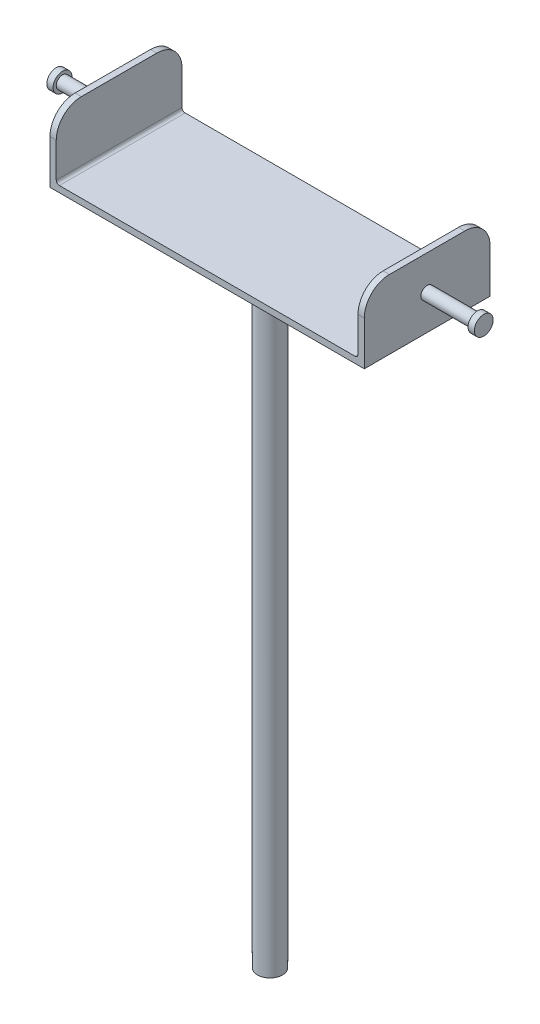
ISO-10303-21;
HEADER;
FILE_DESCRIPTION(('STEP AP214'),'2;1');
FILE_NAME('part.step','',(''),(''),'','','');
FILE_SCHEMA(('AUTOMOTIVE_DESIGN { 1 0 10303 214 1 1 1 1 }'));
ENDSEC;
DATA;
#1=APPLICATION_CONTEXT('core data for automotive mechanical design processes');
#2=APPLICATION_PROTOCOL_DEFINITION('international standard','automotive_design',2000,#1);
#3=PRODUCT_CONTEXT('',#1,'mechanical');
#4=PRODUCT('Part','Part','',(#3));
#5=PRODUCT_RELATED_PRODUCT_CATEGORY('part','',(#4));
#6=PRODUCT_DEFINITION_FORMATION('','',#4);
#7=PRODUCT_DEFINITION_CONTEXT('part definition',#1,'design');
#8=PRODUCT_DEFINITION('design','',#6,#7);
#9=PRODUCT_DEFINITION_SHAPE('','',#8);
#10=(LENGTH_UNIT() NAMED_UNIT(*) SI_UNIT(.MILLI.,.METRE.));
#11=(NAMED_UNIT(*) PLANE_ANGLE_UNIT() SI_UNIT($,.RADIAN.));
#12=(NAMED_UNIT(*) SI_UNIT($,.STERADIAN.) SOLID_ANGLE_UNIT());
#13=UNCERTAINTY_MEASURE_WITH_UNIT(LENGTH_MEASURE(1.E-05),#10,'distance_accuracy_value','');
#14=(GEOMETRIC_REPRESENTATION_CONTEXT(3) GLOBAL_UNCERTAINTY_ASSIGNED_CONTEXT((#13)) GLOBAL_UNIT_ASSIGNED_CONTEXT((#10,
#11,#12)) REPRESENTATION_CONTEXT('',''));
#15=CARTESIAN_POINT('',(0.,0.,0.));
#16=DIRECTION('',(0.,0.,1.));
#17=DIRECTION('',(1.,0.,0.));
#18=AXIS2_PLACEMENT_3D('',#15,#16,#17);
#19=CARTESIAN_POINT('',(0.,0.,0.));
#20=DIRECTION('',(0.,1.,0.));
#21=DIRECTION('',(0.,0.,1.));
#22=AXIS2_PLACEMENT_3D('',#19,#20,#21);
#23=PLANE('',#22);
#24=DIRECTION('',(0.,0.,1.));
#25=VECTOR('',#24,1.);
#26=CARTESIAN_POINT('',(-125.,0.,-50.));
#27=LINE('',#26,#25);
#28=CARTESIAN_POINT('',(-125.,0.,-50.));
#29=VERTEX_POINT('',#28);
#30=CARTESIAN_POINT('',(-125.,0.,50.));
#31=VERTEX_POINT('',#30);
#32=EDGE_CURVE('E152',#29,#31,#27,.T.);
#33=ORIENTED_EDGE('',*,*,#32,.F.);
#34=DIRECTION('',(-1.,0.,0.));
#35=VECTOR('',#34,1.);
#36=CARTESIAN_POINT('',(-125.,0.,-50.));
#37=LINE('',#36,#35);
#38=CARTESIAN_POINT('',(125.,0.,-50.));
#39=VERTEX_POINT('',#38);
#40=EDGE_CURVE('E172',#39,#29,#37,.T.);
#41=ORIENTED_EDGE('',*,*,#40,.F.);
#42=DIRECTION('',(0.,0.,-1.));
#43=VECTOR('',#42,1.);
#44=CARTESIAN_POINT('',(125.,0.,-50.));
#45=LINE('',#44,#43);
#46=CARTESIAN_POINT('',(125.,0.,50.));
#47=VERTEX_POINT('',#46);
#48=EDGE_CURVE('E154',#47,#39,#45,.T.);
#49=ORIENTED_EDGE('',*,*,#48,.F.);
#50=DIRECTION('',(1.,0.,0.));
#51=VECTOR('',#50,1.);
#52=CARTESIAN_POINT('',(-125.,0.,50.));
#53=LINE('',#52,#51);
#54=EDGE_CURVE('E137',#31,#47,#53,.T.);
#55=ORIENTED_EDGE('',*,*,#54,.F.);
#56=EDGE_LOOP('',(#33,#41,#49,#55));
#57=FACE_BOUND('',#56,.T.);
#58=CARTESIAN_POINT('',(0.,0.,0.));
#59=DIRECTION('',(0.,1.,0.));
#60=DIRECTION('',(0.,0.,1.));
#61=AXIS2_PLACEMENT_3D('',#58,#59,#60);
#62=CIRCLE('',#61,9.99999999999999);
#63=CARTESIAN_POINT('',(0.,0.,9.99999999999999));
#64=VERTEX_POINT('',#63);
#65=EDGE_CURVE('E219',#64,#64,#62,.F.);
#66=ORIENTED_EDGE('',*,*,#65,.F.);
#67=EDGE_LOOP('',(#66));
#68=FACE_BOUND('',#67,.T.);
#69=ADVANCED_FACE('F32',(#57,#68),#23,.F.);
#70=CARTESIAN_POINT('',(-125.,5.,-50.));
#71=DIRECTION('',(1.,0.,0.));
#72=DIRECTION('',(0.,0.,-1.));
#73=AXIS2_PLACEMENT_3D('',#70,#71,#72);
#74=PLANE('',#73);
#75=DIRECTION('',(0.,0.,1.));
#76=VECTOR('',#75,1.);
#77=CARTESIAN_POINT('',(-125.,55.,-50.));
#78=LINE('',#77,#76);
#79=CARTESIAN_POINT('',(-125.,55.,-30.));
#80=VERTEX_POINT('',#79);
#81=CARTESIAN_POINT('',(-125.,55.,30.));
#82=VERTEX_POINT('',#81);
#83=EDGE_CURVE('E233',#80,#82,#78,.T.);
#84=ORIENTED_EDGE('',*,*,#83,.F.);
#85=CARTESIAN_POINT('',(-125.,35.,-30.));
#86=DIRECTION('',(1.,0.,0.));
#87=DIRECTION('',(0.,0.,-1.));
#88=AXIS2_PLACEMENT_3D('',#85,#86,#87);
#89=CIRCLE('',#88,20.);
#90=CARTESIAN_POINT('',(-125.,35.,-50.));
#91=VERTEX_POINT('',#90);
#92=EDGE_CURVE('E210',#80,#91,#89,.F.);
#93=ORIENTED_EDGE('',*,*,#92,.T.);
#94=DIRECTION('',(0.,-1.,0.));
#95=VECTOR('',#94,1.);
#96=CARTESIAN_POINT('',(-125.,5.,-50.));
#97=LINE('',#96,#95);
#98=EDGE_CURVE('E160',#91,#29,#97,.T.);
#99=ORIENTED_EDGE('',*,*,#98,.T.);
#100=ORIENTED_EDGE('',*,*,#32,.T.);
#101=DIRECTION('',(0.,-1.,0.));
#102=VECTOR('',#101,1.);
#103=CARTESIAN_POINT('',(-125.,5.,50.));
#104=LINE('',#103,#102);
#105=CARTESIAN_POINT('',(-125.,35.,50.));
#106=VERTEX_POINT('',#105);
#107=EDGE_CURVE('E133',#106,#31,#104,.T.);
#108=ORIENTED_EDGE('',*,*,#107,.F.);
#109=CARTESIAN_POINT('',(-125.,35.,30.));
#110=DIRECTION('',(1.,0.,0.));
#111=DIRECTION('',(0.,0.,-1.));
#112=AXIS2_PLACEMENT_3D('',#109,#110,#111);
#113=CIRCLE('',#112,20.);
#114=EDGE_CURVE('E208',#106,#82,#113,.F.);
#115=ORIENTED_EDGE('',*,*,#114,.T.);
#116=EDGE_LOOP('',(#84,#93,#99,#100,#108,#115));
#117=FACE_BOUND('',#116,.T.);
#118=CARTESIAN_POINT('',(-125.,27.5,0.));
#119=DIRECTION('',(1.,0.,0.));
#120=DIRECTION('',(0.,0.,-1.));
#121=AXIS2_PLACEMENT_3D('',#118,#119,#120);
#122=CIRCLE('',#121,5.);
#123=CARTESIAN_POINT('',(-125.,27.5,-4.99999999999996));
#124=VERTEX_POINT('',#123);
#125=EDGE_CURVE('E216',#124,#124,#122,.F.);
#126=ORIENTED_EDGE('',*,*,#125,.F.);
#127=EDGE_LOOP('',(#126));
#128=FACE_BOUND('',#127,.T.);
#129=ADVANCED_FACE('F157',(#117,#128),#74,.F.);
#130=CARTESIAN_POINT('',(0.,5.,0.));
#131=DIRECTION('',(0.,1.,0.));
#132=DIRECTION('',(0.,0.,1.));
#133=AXIS2_PLACEMENT_3D('',#130,#131,#132);
#134=PLANE('',#133);
#135=DIRECTION('',(-1.,0.,0.));
#136=VECTOR('',#135,1.);
#137=CARTESIAN_POINT('',(-125.,5.,-50.));
#138=LINE('',#137,#136);
#139=CARTESIAN_POINT('',(117.5,5.,-50.));
#140=VERTEX_POINT('',#139);
#141=CARTESIAN_POINT('',(-117.5,5.,-50.));
#142=VERTEX_POINT('',#141);
#143=EDGE_CURVE('E177',#140,#142,#138,.T.);
#144=ORIENTED_EDGE('',*,*,#143,.T.);
#145=DIRECTION('',(0.,0.,-1.));
#146=VECTOR('',#145,1.);
#147=CARTESIAN_POINT('',(-117.5,5.,0.));
#148=LINE('',#147,#146);
#149=CARTESIAN_POINT('',(-117.5,5.,50.));
#150=VERTEX_POINT('',#149);
#151=EDGE_CURVE('E335',#142,#150,#148,.F.);
#152=ORIENTED_EDGE('',*,*,#151,.T.);
#153=DIRECTION('',(1.,0.,0.));
#154=VECTOR('',#153,1.);
#155=CARTESIAN_POINT('',(-125.,5.,50.));
#156=LINE('',#155,#154);
#157=CARTESIAN_POINT('',(117.5,5.,50.));
#158=VERTEX_POINT('',#157);
#159=EDGE_CURVE('E174',#150,#158,#156,.T.);
#160=ORIENTED_EDGE('',*,*,#159,.T.);
#161=DIRECTION('',(0.,0.,1.));
#162=VECTOR('',#161,1.);
#163=CARTESIAN_POINT('',(117.5,5.,0.));
#164=LINE('',#163,#162);
#165=EDGE_CURVE('E225',#158,#140,#164,.F.);
#166=ORIENTED_EDGE('',*,*,#165,.T.);
#167=EDGE_LOOP('',(#144,#152,#160,#166));
#168=FACE_BOUND('',#167,.T.);
#169=ADVANCED_FACE('F295',(#168),#134,.T.);
#170=CARTESIAN_POINT('',(-125.,5.,50.));
#171=DIRECTION('',(0.,0.,-1.));
#172=DIRECTION('',(-1.,0.,0.));
#173=AXIS2_PLACEMENT_3D('',#170,#171,#172);
#174=PLANE('',#173);
#175=DIRECTION('',(0.,-1.,0.));
#176=VECTOR('',#175,1.);
#177=CARTESIAN_POINT('',(125.,5.,50.));
#178=LINE('',#177,#176);
#179=CARTESIAN_POINT('',(125.,35.,50.));
#180=VERTEX_POINT('',#179);
#181=EDGE_CURVE('E146',#180,#47,#178,.T.);
#182=ORIENTED_EDGE('',*,*,#181,.F.);
#183=DIRECTION('',(1.,0.,0.));
#184=VECTOR('',#183,1.);
#185=CARTESIAN_POINT('',(120.,35.,50.));
#186=LINE('',#185,#184);
#187=CARTESIAN_POINT('',(120.,35.,50.));
#188=VERTEX_POINT('',#187);
#189=EDGE_CURVE('E200',#180,#188,#186,.F.);
#190=ORIENTED_EDGE('',*,*,#189,.T.);
#191=DIRECTION('',(0.,-1.,0.));
#192=VECTOR('',#191,1.);
#193=CARTESIAN_POINT('',(120.,55.,50.));
#194=LINE('',#193,#192);
#195=CARTESIAN_POINT('',(120.,7.5,50.));
#196=VERTEX_POINT('',#195);
#197=EDGE_CURVE('E238',#188,#196,#194,.T.);
#198=ORIENTED_EDGE('',*,*,#197,.T.);
#199=CARTESIAN_POINT('',(117.5,7.5,50.));
#200=DIRECTION('',(0.,0.,-1.));
#201=DIRECTION('',(-1.,0.,0.));
#202=AXIS2_PLACEMENT_3D('',#199,#200,#201);
#203=CIRCLE('',#202,2.5);
#204=EDGE_CURVE('E40',#196,#158,#203,.T.);
#205=ORIENTED_EDGE('',*,*,#204,.T.);
#206=ORIENTED_EDGE('',*,*,#159,.F.);
#207=CARTESIAN_POINT('',(-117.5,7.5,50.));
#208=DIRECTION('',(0.,0.,-1.));
#209=DIRECTION('',(-1.,0.,0.));
#210=AXIS2_PLACEMENT_3D('',#207,#208,#209);
#211=CIRCLE('',#210,2.5);
#212=CARTESIAN_POINT('',(-120.,7.5,50.));
#213=VERTEX_POINT('',#212);
#214=EDGE_CURVE('E334',#150,#213,#211,.T.);
#215=ORIENTED_EDGE('',*,*,#214,.T.);
#216=DIRECTION('',(0.,-1.,0.));
#217=VECTOR('',#216,1.);
#218=CARTESIAN_POINT('',(-120.,55.,50.));
#219=LINE('',#218,#217);
#220=CARTESIAN_POINT('',(-120.,35.,50.));
#221=VERTEX_POINT('',#220);
#222=EDGE_CURVE('E162',#221,#213,#219,.T.);
#223=ORIENTED_EDGE('',*,*,#222,.F.);
#224=DIRECTION('',(1.,0.,0.));
#225=VECTOR('',#224,1.);
#226=CARTESIAN_POINT('',(-125.,35.,50.));
#227=LINE('',#226,#225);
#228=EDGE_CURVE('E141',#221,#106,#227,.F.);
#229=ORIENTED_EDGE('',*,*,#228,.T.);
#230=ORIENTED_EDGE('',*,*,#107,.T.);
#231=ORIENTED_EDGE('',*,*,#54,.T.);
#232=EDGE_LOOP('',(#182,#190,#198,#205,#206,#215,#223,#229,#230,#231));
#233=FACE_BOUND('',#232,.T.);
#234=ADVANCED_FACE('F136',(#233),#174,.F.);
#235=CARTESIAN_POINT('',(125.,5.,-50.));
#236=DIRECTION('',(-1.,0.,0.));
#237=DIRECTION('',(0.,0.,1.));
#238=AXIS2_PLACEMENT_3D('',#235,#236,#237);
#239=PLANE('',#238);
#240=CARTESIAN_POINT('',(125.,27.5,0.));
#241=DIRECTION('',(-1.,0.,0.));
#242=DIRECTION('',(0.,0.,1.));
#243=AXIS2_PLACEMENT_3D('',#240,#241,#242);
#244=CIRCLE('',#243,5.);
#245=CARTESIAN_POINT('',(125.,27.5,4.99999999999999));
#246=VERTEX_POINT('',#245);
#247=EDGE_CURVE('E247',#246,#246,#244,.T.);
#248=ORIENTED_EDGE('',*,*,#247,.T.);
#249=EDGE_LOOP('',(#248));
#250=FACE_BOUND('',#249,.T.);
#251=DIRECTION('',(0.,-1.,0.));
#252=VECTOR('',#251,1.);
#253=CARTESIAN_POINT('',(125.,5.,-50.));
#254=LINE('',#253,#252);
#255=CARTESIAN_POINT('',(125.,35.,-50.));
#256=VERTEX_POINT('',#255);
#257=EDGE_CURVE('E176',#256,#39,#254,.T.);
#258=ORIENTED_EDGE('',*,*,#257,.F.);
#259=CARTESIAN_POINT('',(125.,35.,-30.));
#260=DIRECTION('',(-1.,0.,0.));
#261=DIRECTION('',(0.,0.,1.));
#262=AXIS2_PLACEMENT_3D('',#259,#260,#261);
#263=CIRCLE('',#262,20.);
#264=CARTESIAN_POINT('',(125.,55.,-30.));
#265=VERTEX_POINT('',#264);
#266=EDGE_CURVE('E197',#256,#265,#263,.F.);
#267=ORIENTED_EDGE('',*,*,#266,.T.);
#268=DIRECTION('',(0.,0.,-1.));
#269=VECTOR('',#268,1.);
#270=CARTESIAN_POINT('',(125.,55.,-50.));
#271=LINE('',#270,#269);
#272=CARTESIAN_POINT('',(125.,55.,30.));
#273=VERTEX_POINT('',#272);
#274=EDGE_CURVE('E241',#273,#265,#271,.T.);
#275=ORIENTED_EDGE('',*,*,#274,.F.);
#276=CARTESIAN_POINT('',(125.,35.,30.));
#277=DIRECTION('',(-1.,0.,0.));
#278=DIRECTION('',(0.,0.,1.));
#279=AXIS2_PLACEMENT_3D('',#276,#277,#278);
#280=CIRCLE('',#279,20.);
#281=EDGE_CURVE('E195',#273,#180,#280,.F.);
#282=ORIENTED_EDGE('',*,*,#281,.T.);
#283=ORIENTED_EDGE('',*,*,#181,.T.);
#284=ORIENTED_EDGE('',*,*,#48,.T.);
#285=EDGE_LOOP('',(#258,#267,#275,#282,#283,#284));
#286=FACE_BOUND('',#285,.T.);
#287=ADVANCED_FACE('F362',(#250,#286),#239,.F.);
#288=CARTESIAN_POINT('',(-125.,5.,-50.));
#289=DIRECTION('',(0.,0.,1.));
#290=DIRECTION('',(1.,0.,0.));
#291=AXIS2_PLACEMENT_3D('',#288,#289,#290);
#292=PLANE('',#291);
#293=DIRECTION('',(0.,-1.,0.));
#294=VECTOR('',#293,1.);
#295=CARTESIAN_POINT('',(120.,55.,-50.));
#296=LINE('',#295,#294);
#297=CARTESIAN_POINT('',(120.,35.,-50.));
#298=VERTEX_POINT('',#297);
#299=CARTESIAN_POINT('',(120.,7.5,-50.));
#300=VERTEX_POINT('',#299);
#301=EDGE_CURVE('E236',#298,#300,#296,.T.);
#302=ORIENTED_EDGE('',*,*,#301,.F.);
#303=DIRECTION('',(-1.,0.,0.));
#304=VECTOR('',#303,1.);
#305=CARTESIAN_POINT('',(125.,35.,-50.));
#306=LINE('',#305,#304);
#307=EDGE_CURVE('E193',#298,#256,#306,.F.);
#308=ORIENTED_EDGE('',*,*,#307,.T.);
#309=ORIENTED_EDGE('',*,*,#257,.T.);
#310=ORIENTED_EDGE('',*,*,#40,.T.);
#311=ORIENTED_EDGE('',*,*,#98,.F.);
#312=DIRECTION('',(-1.,0.,0.));
#313=VECTOR('',#312,1.);
#314=CARTESIAN_POINT('',(-120.,35.,-50.));
#315=LINE('',#314,#313);
#316=CARTESIAN_POINT('',(-120.,35.,-50.));
#317=VERTEX_POINT('',#316);
#318=EDGE_CURVE('E191',#91,#317,#315,.F.);
#319=ORIENTED_EDGE('',*,*,#318,.T.);
#320=DIRECTION('',(0.,-1.,0.));
#321=VECTOR('',#320,1.);
#322=CARTESIAN_POINT('',(-120.,55.,-50.));
#323=LINE('',#322,#321);
#324=CARTESIAN_POINT('',(-120.,7.5,-50.));
#325=VERTEX_POINT('',#324);
#326=EDGE_CURVE('E165',#317,#325,#323,.T.);
#327=ORIENTED_EDGE('',*,*,#326,.T.);
#328=CARTESIAN_POINT('',(-117.5,7.5,-50.));
#329=DIRECTION('',(0.,0.,1.));
#330=DIRECTION('',(1.,0.,0.));
#331=AXIS2_PLACEMENT_3D('',#328,#329,#330);
#332=CIRCLE('',#331,2.5);
#333=EDGE_CURVE('E337',#325,#142,#332,.T.);
#334=ORIENTED_EDGE('',*,*,#333,.T.);
#335=ORIENTED_EDGE('',*,*,#143,.F.);
#336=CARTESIAN_POINT('',(117.5,7.5,-50.));
#337=DIRECTION('',(0.,0.,1.));
#338=DIRECTION('',(1.,0.,0.));
#339=AXIS2_PLACEMENT_3D('',#336,#337,#338);
#340=CIRCLE('',#339,2.5);
#341=EDGE_CURVE('E11',#140,#300,#340,.T.);
#342=ORIENTED_EDGE('',*,*,#341,.T.);
#343=EDGE_LOOP('',(#302,#308,#309,#310,#311,#319,#327,#334,#335,#342));
#344=FACE_BOUND('',#343,.T.);
#345=ADVANCED_FACE('F344',(#344),#292,.F.);
#346=CARTESIAN_POINT('',(-120.,55.,-50.));
#347=DIRECTION('',(-1.,0.,0.));
#348=DIRECTION('',(0.,0.,1.));
#349=AXIS2_PLACEMENT_3D('',#346,#347,#348);
#350=PLANE('',#349);
#351=ORIENTED_EDGE('',*,*,#222,.T.);
#352=DIRECTION('',(0.,0.,-1.));
#353=VECTOR('',#352,1.);
#354=CARTESIAN_POINT('',(-120.,7.5,-50.));
#355=LINE('',#354,#353);
#356=EDGE_CURVE('E222',#213,#325,#355,.T.);
#357=ORIENTED_EDGE('',*,*,#356,.T.);
#358=ORIENTED_EDGE('',*,*,#326,.F.);
#359=CARTESIAN_POINT('',(-120.,35.,-30.));
#360=DIRECTION('',(-1.,0.,0.));
#361=DIRECTION('',(0.,0.,1.));
#362=AXIS2_PLACEMENT_3D('',#359,#360,#361);
#363=CIRCLE('',#362,20.);
#364=CARTESIAN_POINT('',(-120.,55.,-30.));
#365=VERTEX_POINT('',#364);
#366=EDGE_CURVE('E214',#317,#365,#363,.F.);
#367=ORIENTED_EDGE('',*,*,#366,.T.);
#368=DIRECTION('',(0.,0.,-1.));
#369=VECTOR('',#368,1.);
#370=CARTESIAN_POINT('',(-120.,55.,-50.));
#371=LINE('',#370,#369);
#372=CARTESIAN_POINT('',(-120.,55.,30.));
#373=VERTEX_POINT('',#372);
#374=EDGE_CURVE('E188',#373,#365,#371,.T.);
#375=ORIENTED_EDGE('',*,*,#374,.F.);
#376=CARTESIAN_POINT('',(-120.,35.,30.));
#377=DIRECTION('',(-1.,0.,0.));
#378=DIRECTION('',(0.,0.,1.));
#379=AXIS2_PLACEMENT_3D('',#376,#377,#378);
#380=CIRCLE('',#379,20.);
#381=EDGE_CURVE('E212',#373,#221,#380,.F.);
#382=ORIENTED_EDGE('',*,*,#381,.T.);
#383=EDGE_LOOP('',(#351,#357,#358,#367,#375,#382));
#384=FACE_BOUND('',#383,.T.);
#385=ADVANCED_FACE('F371',(#384),#350,.F.);
#386=CARTESIAN_POINT('',(0.,55.,0.));
#387=DIRECTION('',(0.,1.,0.));
#388=DIRECTION('',(0.,0.,1.));
#389=AXIS2_PLACEMENT_3D('',#386,#387,#388);
#390=PLANE('',#389);
#391=ORIENTED_EDGE('',*,*,#374,.T.);
#392=DIRECTION('',(-1.,0.,0.));
#393=VECTOR('',#392,1.);
#394=CARTESIAN_POINT('',(-125.,55.,-30.));
#395=LINE('',#394,#393);
#396=EDGE_CURVE('E205',#365,#80,#395,.T.);
#397=ORIENTED_EDGE('',*,*,#396,.T.);
#398=ORIENTED_EDGE('',*,*,#83,.T.);
#399=DIRECTION('',(1.,0.,0.));
#400=VECTOR('',#399,1.);
#401=CARTESIAN_POINT('',(-120.,55.,30.));
#402=LINE('',#401,#400);
#403=EDGE_CURVE('E202',#82,#373,#402,.T.);
#404=ORIENTED_EDGE('',*,*,#403,.T.);
#405=EDGE_LOOP('',(#391,#397,#398,#404));
#406=FACE_BOUND('',#405,.T.);
#407=ADVANCED_FACE('F373',(#406),#390,.T.);
#408=CARTESIAN_POINT('',(120.,55.,-50.));
#409=DIRECTION('',(1.,0.,0.));
#410=DIRECTION('',(0.,0.,-1.));
#411=AXIS2_PLACEMENT_3D('',#408,#409,#410);
#412=PLANE('',#411);
#413=ORIENTED_EDGE('',*,*,#301,.T.);
#414=DIRECTION('',(0.,0.,1.));
#415=VECTOR('',#414,1.);
#416=CARTESIAN_POINT('',(120.,7.5,-50.));
#417=LINE('',#416,#415);
#418=EDGE_CURVE('E339',#300,#196,#417,.T.);
#419=ORIENTED_EDGE('',*,*,#418,.T.);
#420=ORIENTED_EDGE('',*,*,#197,.F.);
#421=CARTESIAN_POINT('',(120.,35.,30.));
#422=DIRECTION('',(1.,0.,0.));
#423=DIRECTION('',(0.,0.,-1.));
#424=AXIS2_PLACEMENT_3D('',#421,#422,#423);
#425=CIRCLE('',#424,20.);
#426=CARTESIAN_POINT('',(120.,55.,30.));
#427=VERTEX_POINT('',#426);
#428=EDGE_CURVE('E352',#188,#427,#425,.F.);
#429=ORIENTED_EDGE('',*,*,#428,.T.);
#430=DIRECTION('',(0.,0.,1.));
#431=VECTOR('',#430,1.);
#432=CARTESIAN_POINT('',(120.,55.,-50.));
#433=LINE('',#432,#431);
#434=CARTESIAN_POINT('',(120.,55.,-30.));
#435=VERTEX_POINT('',#434);
#436=EDGE_CURVE('E244',#435,#427,#433,.T.);
#437=ORIENTED_EDGE('',*,*,#436,.F.);
#438=CARTESIAN_POINT('',(120.,35.,-30.));
#439=DIRECTION('',(1.,0.,0.));
#440=DIRECTION('',(0.,0.,-1.));
#441=AXIS2_PLACEMENT_3D('',#438,#439,#440);
#442=CIRCLE('',#441,20.);
#443=EDGE_CURVE('E189',#435,#298,#442,.F.);
#444=ORIENTED_EDGE('',*,*,#443,.T.);
#445=EDGE_LOOP('',(#413,#419,#420,#429,#437,#444));
#446=FACE_BOUND('',#445,.T.);
#447=ADVANCED_FACE('F347',(#446),#412,.F.);
#448=CARTESIAN_POINT('',(0.,55.,0.));
#449=DIRECTION('',(0.,1.,0.));
#450=DIRECTION('',(0.,0.,1.));
#451=AXIS2_PLACEMENT_3D('',#448,#449,#450);
#452=PLANE('',#451);
#453=ORIENTED_EDGE('',*,*,#274,.T.);
#454=DIRECTION('',(-1.,0.,0.));
#455=VECTOR('',#454,1.);
#456=CARTESIAN_POINT('',(120.,55.,-30.));
#457=LINE('',#456,#455);
#458=EDGE_CURVE('E354',#265,#435,#457,.T.);
#459=ORIENTED_EDGE('',*,*,#458,.T.);
#460=ORIENTED_EDGE('',*,*,#436,.T.);
#461=DIRECTION('',(1.,0.,0.));
#462=VECTOR('',#461,1.);
#463=CARTESIAN_POINT('',(125.,55.,30.));
#464=LINE('',#463,#462);
#465=EDGE_CURVE('E145',#427,#273,#464,.T.);
#466=ORIENTED_EDGE('',*,*,#465,.T.);
#467=EDGE_LOOP('',(#453,#459,#460,#466));
#468=FACE_BOUND('',#467,.T.);
#469=ADVANCED_FACE('F311',(#468),#452,.T.);
#470=CARTESIAN_POINT('',(0.,35.,-30.));
#471=DIRECTION('',(1.,0.,0.));
#472=DIRECTION('',(0.,0.,-1.));
#473=AXIS2_PLACEMENT_3D('',#470,#471,#472);
#474=CYLINDRICAL_SURFACE('',#473,20.);
#475=ORIENTED_EDGE('',*,*,#266,.F.);
#476=ORIENTED_EDGE('',*,*,#307,.F.);
#477=ORIENTED_EDGE('',*,*,#443,.F.);
#478=ORIENTED_EDGE('',*,*,#458,.F.);
#479=EDGE_LOOP('',(#475,#476,#477,#478));
#480=FACE_BOUND('',#479,.T.);
#481=ADVANCED_FACE('F307',(#480),#474,.T.);
#482=CARTESIAN_POINT('',(0.,35.,30.));
#483=DIRECTION('',(-1.,0.,0.));
#484=DIRECTION('',(0.,0.,1.));
#485=AXIS2_PLACEMENT_3D('',#482,#483,#484);
#486=CYLINDRICAL_SURFACE('',#485,20.);
#487=ORIENTED_EDGE('',*,*,#428,.F.);
#488=ORIENTED_EDGE('',*,*,#189,.F.);
#489=ORIENTED_EDGE('',*,*,#281,.F.);
#490=ORIENTED_EDGE('',*,*,#465,.F.);
#491=EDGE_LOOP('',(#487,#488,#489,#490));
#492=FACE_BOUND('',#491,.T.);
#493=ADVANCED_FACE('F310',(#492),#486,.T.);
#494=CARTESIAN_POINT('',(0.,35.,-30.));
#495=DIRECTION('',(1.,0.,0.));
#496=DIRECTION('',(0.,0.,-1.));
#497=AXIS2_PLACEMENT_3D('',#494,#495,#496);
#498=CYLINDRICAL_SURFACE('',#497,20.);
#499=ORIENTED_EDGE('',*,*,#366,.F.);
#500=ORIENTED_EDGE('',*,*,#318,.F.);
#501=ORIENTED_EDGE('',*,*,#92,.F.);
#502=ORIENTED_EDGE('',*,*,#396,.F.);
#503=EDGE_LOOP('',(#499,#500,#501,#502));
#504=FACE_BOUND('',#503,.T.);
#505=ADVANCED_FACE('F315',(#504),#498,.T.);
#506=CARTESIAN_POINT('',(0.,35.,30.));
#507=DIRECTION('',(-1.,0.,0.));
#508=DIRECTION('',(0.,0.,1.));
#509=AXIS2_PLACEMENT_3D('',#506,#507,#508);
#510=CYLINDRICAL_SURFACE('',#509,20.);
#511=ORIENTED_EDGE('',*,*,#114,.F.);
#512=ORIENTED_EDGE('',*,*,#228,.F.);
#513=ORIENTED_EDGE('',*,*,#381,.F.);
#514=ORIENTED_EDGE('',*,*,#403,.F.);
#515=EDGE_LOOP('',(#511,#512,#513,#514));
#516=FACE_BOUND('',#515,.T.);
#517=ADVANCED_FACE('F319',(#516),#510,.T.);
#518=CARTESIAN_POINT('',(165.,27.5,0.));
#519=DIRECTION('',(-1.,0.,0.));
#520=DIRECTION('',(0.,0.,1.));
#521=AXIS2_PLACEMENT_3D('',#518,#519,#520);
#522=CYLINDRICAL_SURFACE('',#521,5.);
#523=CARTESIAN_POINT('',(165.,27.5,0.));
#524=DIRECTION('',(1.,0.,0.));
#525=DIRECTION('',(0.,0.,-1.));
#526=AXIS2_PLACEMENT_3D('',#523,#524,#525);
#527=CIRCLE('',#526,5.);
#528=CARTESIAN_POINT('',(165.,27.5,-5.00000000000002));
#529=VERTEX_POINT('',#528);
#530=EDGE_CURVE('E256',#529,#529,#527,.F.);
#531=ORIENTED_EDGE('',*,*,#530,.T.);
#532=EDGE_LOOP('',(#531));
#533=FACE_BOUND('',#532,.T.);
#534=ORIENTED_EDGE('',*,*,#247,.F.);
#535=EDGE_LOOP('',(#534));
#536=FACE_BOUND('',#535,.T.);
#537=ADVANCED_FACE('F291',(#533,#536),#522,.T.);
#538=CARTESIAN_POINT('',(-165.,27.5,0.));
#539=DIRECTION('',(1.,0.,0.));
#540=DIRECTION('',(0.,0.,-1.));
#541=AXIS2_PLACEMENT_3D('',#538,#539,#540);
#542=CYLINDRICAL_SURFACE('',#541,5.);
#543=CARTESIAN_POINT('',(-165.,27.5,0.));
#544=DIRECTION('',(-1.,0.,0.));
#545=DIRECTION('',(0.,0.,1.));
#546=AXIS2_PLACEMENT_3D('',#543,#544,#545);
#547=CIRCLE('',#546,5.);
#548=CARTESIAN_POINT('',(-165.,27.5,5.00000000000005));
#549=VERTEX_POINT('',#548);
#550=EDGE_CURVE('E250',#549,#549,#547,.T.);
#551=ORIENTED_EDGE('',*,*,#550,.F.);
#552=EDGE_LOOP('',(#551));
#553=FACE_BOUND('',#552,.T.);
#554=ORIENTED_EDGE('',*,*,#125,.T.);
#555=EDGE_LOOP('',(#554));
#556=FACE_BOUND('',#555,.T.);
#557=ADVANCED_FACE('F287',(#553,#556),#542,.T.);
#558=CARTESIAN_POINT('',(0.,-500.,0.));
#559=DIRECTION('',(0.,1.,0.));
#560=DIRECTION('',(0.,0.,1.));
#561=AXIS2_PLACEMENT_3D('',#558,#559,#560);
#562=CYLINDRICAL_SURFACE('',#561,9.99999999999999);
#563=CARTESIAN_POINT('',(0.,-500.,0.));
#564=DIRECTION('',(0.,-1.,0.));
#565=DIRECTION('',(0.,0.,-1.));
#566=AXIS2_PLACEMENT_3D('',#563,#564,#565);
#567=CIRCLE('',#566,9.99999999999999);
#568=CARTESIAN_POINT('',(0.,-500.,-9.99999999999999));
#569=VERTEX_POINT('',#568);
#570=EDGE_CURVE('E253',#569,#569,#567,.T.);
#571=ORIENTED_EDGE('',*,*,#570,.F.);
#572=EDGE_LOOP('',(#571));
#573=FACE_BOUND('',#572,.T.);
#574=ORIENTED_EDGE('',*,*,#65,.T.);
#575=EDGE_LOOP('',(#574));
#576=FACE_BOUND('',#575,.T.);
#577=ADVANCED_FACE('F290',(#573,#576),#562,.T.);
#578=CARTESIAN_POINT('',(0.,-500.,0.));
#579=DIRECTION('',(0.,-1.,0.));
#580=DIRECTION('',(0.,0.,-1.));
#581=AXIS2_PLACEMENT_3D('',#578,#579,#580);
#582=PLANE('',#581);
#583=ORIENTED_EDGE('',*,*,#570,.T.);
#584=EDGE_LOOP('',(#583));
#585=FACE_BOUND('',#584,.T.);
#586=ADVANCED_FACE('F457',(#585),#582,.T.);
#587=CARTESIAN_POINT('',(170.,27.5,0.));
#588=DIRECTION('',(-1.,0.,0.));
#589=DIRECTION('',(0.,0.,1.));
#590=AXIS2_PLACEMENT_3D('',#587,#588,#589);
#591=CYLINDRICAL_SURFACE('',#590,7.5);
#592=CARTESIAN_POINT('',(170.,27.5,0.));
#593=DIRECTION('',(1.,0.,0.));
#594=DIRECTION('',(0.,0.,-1.));
#595=AXIS2_PLACEMENT_3D('',#592,#593,#594);
#596=CIRCLE('',#595,7.5);
#597=CARTESIAN_POINT('',(170.,27.5,-7.50000000000002));
#598=VERTEX_POINT('',#597);
#599=EDGE_CURVE('E259',#598,#598,#596,.T.);
#600=ORIENTED_EDGE('',*,*,#599,.F.);
#601=EDGE_LOOP('',(#600));
#602=FACE_BOUND('',#601,.T.);
#603=CARTESIAN_POINT('',(165.,27.5,0.));
#604=DIRECTION('',(1.,0.,0.));
#605=DIRECTION('',(0.,0.,-1.));
#606=AXIS2_PLACEMENT_3D('',#603,#604,#605);
#607=CIRCLE('',#606,7.5);
#608=CARTESIAN_POINT('',(165.,27.5,-7.50000000000002));
#609=VERTEX_POINT('',#608);
#610=EDGE_CURVE('E260',#609,#609,#607,.T.);
#611=ORIENTED_EDGE('',*,*,#610,.T.);
#612=EDGE_LOOP('',(#611));
#613=FACE_BOUND('',#612,.T.);
#614=ADVANCED_FACE('F466',(#602,#613),#591,.T.);
#615=CARTESIAN_POINT('',(170.,27.5,0.));
#616=DIRECTION('',(1.,0.,0.));
#617=DIRECTION('',(0.,0.,-1.));
#618=AXIS2_PLACEMENT_3D('',#615,#616,#617);
#619=PLANE('',#618);
#620=ORIENTED_EDGE('',*,*,#599,.T.);
#621=EDGE_LOOP('',(#620));
#622=FACE_BOUND('',#621,.T.);
#623=ADVANCED_FACE('F476',(#622),#619,.T.);
#624=CARTESIAN_POINT('',(165.,27.5,0.));
#625=DIRECTION('',(1.,0.,0.));
#626=DIRECTION('',(0.,0.,-1.));
#627=AXIS2_PLACEMENT_3D('',#624,#625,#626);
#628=PLANE('',#627);
#629=ORIENTED_EDGE('',*,*,#530,.F.);
#630=EDGE_LOOP('',(#629));
#631=FACE_BOUND('',#630,.T.);
#632=ORIENTED_EDGE('',*,*,#610,.F.);
#633=EDGE_LOOP('',(#632));
#634=FACE_BOUND('',#633,.T.);
#635=ADVANCED_FACE('F283',(#631,#634),#628,.F.);
#636=CARTESIAN_POINT('',(-165.,27.5,0.));
#637=DIRECTION('',(-1.,0.,0.));
#638=DIRECTION('',(0.,0.,1.));
#639=AXIS2_PLACEMENT_3D('',#636,#637,#638);
#640=PLANE('',#639);
#641=CARTESIAN_POINT('',(-165.,27.5,0.));
#642=DIRECTION('',(-1.,0.,0.));
#643=DIRECTION('',(0.,0.,1.));
#644=AXIS2_PLACEMENT_3D('',#641,#642,#643);
#645=CIRCLE('',#644,7.5);
#646=CARTESIAN_POINT('',(-165.,27.5,7.50000000000005));
#647=VERTEX_POINT('',#646);
#648=EDGE_CURVE('E266',#647,#647,#645,.T.);
#649=ORIENTED_EDGE('',*,*,#648,.F.);
#650=EDGE_LOOP('',(#649));
#651=FACE_BOUND('',#650,.T.);
#652=ORIENTED_EDGE('',*,*,#550,.T.);
#653=EDGE_LOOP('',(#652));
#654=FACE_BOUND('',#653,.T.);
#655=ADVANCED_FACE('F277',(#651,#654),#640,.F.);
#656=CARTESIAN_POINT('',(-170.,27.5,0.));
#657=DIRECTION('',(1.,0.,0.));
#658=DIRECTION('',(0.,0.,-1.));
#659=AXIS2_PLACEMENT_3D('',#656,#657,#658);
#660=CYLINDRICAL_SURFACE('',#659,7.5);
#661=CARTESIAN_POINT('',(-170.,27.5,0.));
#662=DIRECTION('',(-1.,0.,0.));
#663=DIRECTION('',(0.,0.,1.));
#664=AXIS2_PLACEMENT_3D('',#661,#662,#663);
#665=CIRCLE('',#664,7.5);
#666=CARTESIAN_POINT('',(-170.,27.5,7.50000000000005));
#667=VERTEX_POINT('',#666);
#668=EDGE_CURVE('E263',#667,#667,#665,.T.);
#669=ORIENTED_EDGE('',*,*,#668,.F.);
#670=EDGE_LOOP('',(#669));
#671=FACE_BOUND('',#670,.T.);
#672=ORIENTED_EDGE('',*,*,#648,.T.);
#673=EDGE_LOOP('',(#672));
#674=FACE_BOUND('',#673,.T.);
#675=ADVANCED_FACE('F274',(#671,#674),#660,.T.);
#676=CARTESIAN_POINT('',(-170.,27.5,0.));
#677=DIRECTION('',(-1.,0.,0.));
#678=DIRECTION('',(0.,0.,1.));
#679=AXIS2_PLACEMENT_3D('',#676,#677,#678);
#680=PLANE('',#679);
#681=ORIENTED_EDGE('',*,*,#668,.T.);
#682=EDGE_LOOP('',(#681));
#683=FACE_BOUND('',#682,.T.);
#684=ADVANCED_FACE('F272',(#683),#680,.T.);
#685=CARTESIAN_POINT('',(-117.5,7.5,-50.));
#686=DIRECTION('',(0.,0.,-1.));
#687=DIRECTION('',(-1.,0.,0.));
#688=AXIS2_PLACEMENT_3D('',#685,#686,#687);
#689=CYLINDRICAL_SURFACE('',#688,2.5);
#690=ORIENTED_EDGE('',*,*,#214,.F.);
#691=ORIENTED_EDGE('',*,*,#151,.F.);
#692=ORIENTED_EDGE('',*,*,#333,.F.);
#693=ORIENTED_EDGE('',*,*,#356,.F.);
#694=EDGE_LOOP('',(#690,#691,#692,#693));
#695=FACE_BOUND('',#694,.T.);
#696=ADVANCED_FACE('F323',(#695),#689,.F.);
#697=CARTESIAN_POINT('',(117.5,7.5,-50.));
#698=DIRECTION('',(0.,0.,1.));
#699=DIRECTION('',(1.,0.,0.));
#700=AXIS2_PLACEMENT_3D('',#697,#698,#699);
#701=CYLINDRICAL_SURFACE('',#700,2.5);
#702=ORIENTED_EDGE('',*,*,#341,.F.);
#703=ORIENTED_EDGE('',*,*,#165,.F.);
#704=ORIENTED_EDGE('',*,*,#204,.F.);
#705=ORIENTED_EDGE('',*,*,#418,.F.);
#706=EDGE_LOOP('',(#702,#703,#704,#705));
#707=FACE_BOUND('',#706,.T.);
#708=ADVANCED_FACE('F34',(#707),#701,.F.);
#709=CLOSED_SHELL('',(#69,#129,#169,#234,#287,#345,#385,#407,#447,#469,#481,#493,#505,#517,#537,
#557,#577,#586,#614,#623,#635,#655,#675,#684,#696,#708));
#710=MANIFOLD_SOLID_BREP('B2',#709);
#711=ADVANCED_BREP_SHAPE_REPRESENTATION('',(#18,#710),#14);
#712=SHAPE_DEFINITION_REPRESENTATION(#9,#711);
ENDSEC;
END-ISO-10303-21;
